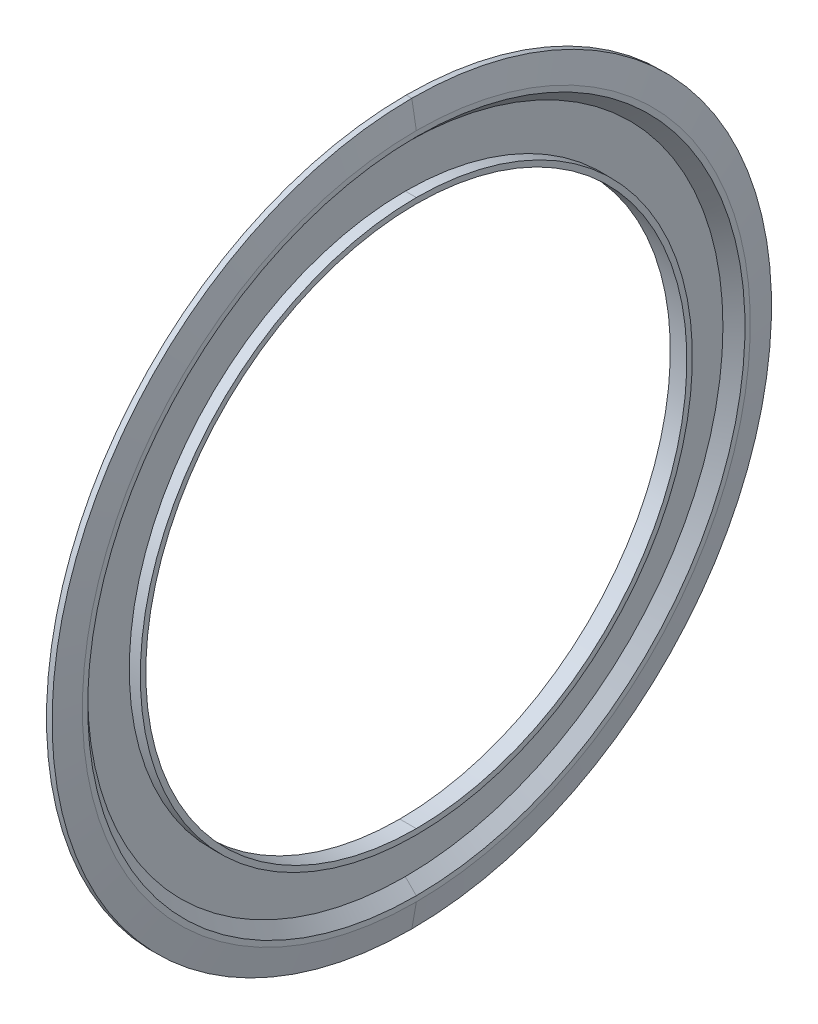
ISO-10303-21;
HEADER;
FILE_DESCRIPTION(('STEP AP214'),'2;1');
FILE_NAME('part.step','',(''),(''),'','','');
FILE_SCHEMA(('AUTOMOTIVE_DESIGN { 1 0 10303 214 1 1 1 1 }'));
ENDSEC;
DATA;
#1=APPLICATION_CONTEXT('core data for automotive mechanical design processes');
#2=APPLICATION_PROTOCOL_DEFINITION('international standard','automotive_design',2000,#1);
#3=PRODUCT_CONTEXT('',#1,'mechanical');
#4=PRODUCT('Part','Part','',(#3));
#5=PRODUCT_RELATED_PRODUCT_CATEGORY('part','',(#4));
#6=PRODUCT_DEFINITION_FORMATION('','',#4);
#7=PRODUCT_DEFINITION_CONTEXT('part definition',#1,'design');
#8=PRODUCT_DEFINITION('design','',#6,#7);
#9=PRODUCT_DEFINITION_SHAPE('','',#8);
#10=(LENGTH_UNIT() NAMED_UNIT(*) SI_UNIT(.MILLI.,.METRE.));
#11=(NAMED_UNIT(*) PLANE_ANGLE_UNIT() SI_UNIT($,.RADIAN.));
#12=(NAMED_UNIT(*) SI_UNIT($,.STERADIAN.) SOLID_ANGLE_UNIT());
#13=UNCERTAINTY_MEASURE_WITH_UNIT(LENGTH_MEASURE(1.E-05),#10,'distance_accuracy_value','');
#14=(GEOMETRIC_REPRESENTATION_CONTEXT(3) GLOBAL_UNCERTAINTY_ASSIGNED_CONTEXT((#13)) GLOBAL_UNIT_ASSIGNED_CONTEXT((#10,
#11,#12)) REPRESENTATION_CONTEXT('',''));
#15=CARTESIAN_POINT('',(0.,0.,0.));
#16=DIRECTION('',(0.,0.,1.));
#17=DIRECTION('',(1.,0.,0.));
#18=AXIS2_PLACEMENT_3D('',#15,#16,#17);
#19=CARTESIAN_POINT('',(1.29101299543363,19.84,0.));
#20=DIRECTION('',(1.,0.,0.));
#21=DIRECTION('',(0.,0.,1.));
#22=AXIS2_PLACEMENT_3D('',#19,#20,#21);
#23=PLANE('',#22);
#24=CARTESIAN_POINT('',(1.29101299543363,0.,0.));
#25=DIRECTION('',(-1.,0.,0.));
#26=DIRECTION('',(0.,1.,0.));
#27=AXIS2_PLACEMENT_3D('',#24,#25,#26);
#28=CIRCLE('',#27,19.68);
#29=CARTESIAN_POINT('',(1.29101299543363,19.68,0.));
#30=VERTEX_POINT('',#29);
#31=CARTESIAN_POINT('',(1.29101299543363,-19.68,0.));
#32=VERTEX_POINT('',#31);
#33=EDGE_CURVE('E11',#30,#32,#28,.T.);
#34=ORIENTED_EDGE('',*,*,#33,.T.);
#35=CARTESIAN_POINT('',(1.29101299543363,0.,0.));
#36=DIRECTION('',(-1.,0.,0.));
#37=DIRECTION('',(0.,1.,0.));
#38=AXIS2_PLACEMENT_3D('',#35,#36,#37);
#39=CIRCLE('',#38,19.68);
#40=EDGE_CURVE('E112',#32,#30,#39,.T.);
#41=ORIENTED_EDGE('',*,*,#40,.T.);
#42=EDGE_LOOP('',(#34,#41));
#43=FACE_BOUND('',#42,.T.);
#44=CARTESIAN_POINT('',(1.29101299543363,0.,0.));
#45=DIRECTION('',(-1.,0.,0.));
#46=DIRECTION('',(0.,1.,0.));
#47=AXIS2_PLACEMENT_3D('',#44,#45,#46);
#48=CIRCLE('',#47,20.);
#49=CARTESIAN_POINT('',(1.29101299543363,20.,0.));
#50=VERTEX_POINT('',#49);
#51=CARTESIAN_POINT('',(1.29101299543363,-20.,0.));
#52=VERTEX_POINT('',#51);
#53=EDGE_CURVE('E190',#50,#52,#48,.T.);
#54=ORIENTED_EDGE('',*,*,#53,.F.);
#55=CARTESIAN_POINT('',(1.29101299543363,0.,0.));
#56=DIRECTION('',(-1.,0.,0.));
#57=DIRECTION('',(0.,1.,0.));
#58=AXIS2_PLACEMENT_3D('',#55,#56,#57);
#59=CIRCLE('',#58,20.);
#60=EDGE_CURVE('E32',#52,#50,#59,.T.);
#61=ORIENTED_EDGE('',*,*,#60,.F.);
#62=EDGE_LOOP('',(#54,#61));
#63=FACE_BOUND('',#62,.T.);
#64=ADVANCED_FACE('F19',(#43,#63),#23,.T.);
#65=CARTESIAN_POINT('',(0.961012995433626,0.,0.));
#66=DIRECTION('',(1.,0.,0.));
#67=DIRECTION('',(0.,1.,0.));
#68=AXIS2_PLACEMENT_3D('',#65,#66,#67);
#69=CONICAL_SURFACE('',#68,19.35,0.785398163397446);
#70=DIRECTION('',(-0.707106781186549,-0.707106781186546,0.));
#71=VECTOR('',#70,1.);
#72=CARTESIAN_POINT('',(0.961012995433626,19.35,0.));
#73=LINE('',#72,#71);
#74=CARTESIAN_POINT('',(0.631012995433625,19.02,0.));
#75=VERTEX_POINT('',#74);
#76=EDGE_CURVE('E107',#30,#75,#73,.T.);
#77=ORIENTED_EDGE('',*,*,#76,.T.);
#78=CARTESIAN_POINT('',(0.631012995433625,0.,0.));
#79=DIRECTION('',(-1.,0.,0.));
#80=DIRECTION('',(0.,1.,0.));
#81=AXIS2_PLACEMENT_3D('',#78,#79,#80);
#82=CIRCLE('',#81,19.02);
#83=CARTESIAN_POINT('',(0.631012995433625,-19.02,0.));
#84=VERTEX_POINT('',#83);
#85=EDGE_CURVE('E26',#75,#84,#82,.T.);
#86=ORIENTED_EDGE('',*,*,#85,.T.);
#87=DIRECTION('',(0.707106781186549,-0.707106781186546,0.));
#88=VECTOR('',#87,1.);
#89=CARTESIAN_POINT('',(0.961012995433626,-19.35,0.));
#90=LINE('',#89,#88);
#91=EDGE_CURVE('E109',#84,#32,#90,.T.);
#92=ORIENTED_EDGE('',*,*,#91,.T.);
#93=ORIENTED_EDGE('',*,*,#33,.F.);
#94=EDGE_LOOP('',(#77,#86,#92,#93));
#95=FACE_BOUND('',#94,.T.);
#96=ADVANCED_FACE('F105',(#95),#69,.F.);
#97=CARTESIAN_POINT('',(0.631012995433625,17.775,0.));
#98=DIRECTION('',(1.,0.,0.));
#99=DIRECTION('',(0.,-1.,0.));
#100=AXIS2_PLACEMENT_3D('',#97,#98,#99);
#101=PLANE('',#100);
#102=CARTESIAN_POINT('',(0.631012995433625,0.,0.));
#103=DIRECTION('',(-1.,0.,0.));
#104=DIRECTION('',(0.,1.,0.));
#105=AXIS2_PLACEMENT_3D('',#102,#103,#104);
#106=CIRCLE('',#105,16.53);
#107=CARTESIAN_POINT('',(0.631012995433625,16.53,0.));
#108=VERTEX_POINT('',#107);
#109=CARTESIAN_POINT('',(0.631012995433625,-16.53,0.));
#110=VERTEX_POINT('',#109);
#111=EDGE_CURVE('E151',#108,#110,#106,.T.);
#112=ORIENTED_EDGE('',*,*,#111,.T.);
#113=CARTESIAN_POINT('',(0.631012995433625,0.,0.));
#114=DIRECTION('',(-1.,0.,0.));
#115=DIRECTION('',(0.,1.,0.));
#116=AXIS2_PLACEMENT_3D('',#113,#114,#115);
#117=CIRCLE('',#116,16.53);
#118=EDGE_CURVE('E130',#110,#108,#117,.T.);
#119=ORIENTED_EDGE('',*,*,#118,.T.);
#120=EDGE_LOOP('',(#112,#119));
#121=FACE_BOUND('',#120,.T.);
#122=ORIENTED_EDGE('',*,*,#85,.F.);
#123=CARTESIAN_POINT('',(0.631012995433625,0.,0.));
#124=DIRECTION('',(-1.,0.,0.));
#125=DIRECTION('',(0.,1.,0.));
#126=AXIS2_PLACEMENT_3D('',#123,#124,#125);
#127=CIRCLE('',#126,19.02);
#128=EDGE_CURVE('E118',#84,#75,#127,.T.);
#129=ORIENTED_EDGE('',*,*,#128,.F.);
#130=EDGE_LOOP('',(#122,#129));
#131=FACE_BOUND('',#130,.T.);
#132=ADVANCED_FACE('F206',(#121,#131),#101,.T.);
#133=CARTESIAN_POINT('',(0.961012995433626,0.,0.));
#134=DIRECTION('',(-1.,0.,0.));
#135=DIRECTION('',(0.,1.,0.));
#136=AXIS2_PLACEMENT_3D('',#133,#134,#135);
#137=CYLINDRICAL_SURFACE('',#136,16.53);
#138=DIRECTION('',(-1.,0.,0.));
#139=VECTOR('',#138,1.);
#140=CARTESIAN_POINT('',(0.961012995433626,16.53,0.));
#141=LINE('',#140,#139);
#142=CARTESIAN_POINT('',(1.29101299543363,16.53,0.));
#143=VERTEX_POINT('',#142);
#144=EDGE_CURVE('E137',#143,#108,#141,.T.);
#145=ORIENTED_EDGE('',*,*,#144,.T.);
#146=ORIENTED_EDGE('',*,*,#118,.F.);
#147=DIRECTION('',(1.,0.,0.));
#148=VECTOR('',#147,1.);
#149=CARTESIAN_POINT('',(0.961012995433626,-16.53,0.));
#150=LINE('',#149,#148);
#151=CARTESIAN_POINT('',(1.29101299543363,-16.53,0.));
#152=VERTEX_POINT('',#151);
#153=EDGE_CURVE('E143',#110,#152,#150,.T.);
#154=ORIENTED_EDGE('',*,*,#153,.T.);
#155=CARTESIAN_POINT('',(1.29101299543363,0.,0.));
#156=DIRECTION('',(-1.,0.,0.));
#157=DIRECTION('',(0.,1.,0.));
#158=AXIS2_PLACEMENT_3D('',#155,#156,#157);
#159=CIRCLE('',#158,16.53);
#160=EDGE_CURVE('E132',#152,#143,#159,.T.);
#161=ORIENTED_EDGE('',*,*,#160,.T.);
#162=EDGE_LOOP('',(#145,#146,#154,#161));
#163=FACE_BOUND('',#162,.T.);
#164=ADVANCED_FACE('F208',(#163),#137,.T.);
#165=CARTESIAN_POINT('',(1.29101299543363,16.365,0.));
#166=DIRECTION('',(1.,0.,0.));
#167=DIRECTION('',(0.,0.,1.));
#168=AXIS2_PLACEMENT_3D('',#165,#166,#167);
#169=PLANE('',#168);
#170=CARTESIAN_POINT('',(1.29101299543363,0.,0.));
#171=DIRECTION('',(-1.,0.,0.));
#172=DIRECTION('',(0.,1.,0.));
#173=AXIS2_PLACEMENT_3D('',#170,#171,#172);
#174=CIRCLE('',#173,16.2);
#175=CARTESIAN_POINT('',(1.29101299543363,16.2,0.));
#176=VERTEX_POINT('',#175);
#177=CARTESIAN_POINT('',(1.29101299543363,-16.2,0.));
#178=VERTEX_POINT('',#177);
#179=EDGE_CURVE('E203',#176,#178,#174,.T.);
#180=ORIENTED_EDGE('',*,*,#179,.T.);
#181=CARTESIAN_POINT('',(1.29101299543363,0.,0.));
#182=DIRECTION('',(-1.,0.,0.));
#183=DIRECTION('',(0.,1.,0.));
#184=AXIS2_PLACEMENT_3D('',#181,#182,#183);
#185=CIRCLE('',#184,16.2);
#186=EDGE_CURVE('E124',#178,#176,#185,.T.);
#187=ORIENTED_EDGE('',*,*,#186,.T.);
#188=EDGE_LOOP('',(#180,#187));
#189=FACE_BOUND('',#188,.T.);
#190=CARTESIAN_POINT('',(1.29101299543363,0.,0.));
#191=DIRECTION('',(-1.,0.,0.));
#192=DIRECTION('',(0.,1.,0.));
#193=AXIS2_PLACEMENT_3D('',#190,#191,#192);
#194=CIRCLE('',#193,16.53);
#195=EDGE_CURVE('E140',#143,#152,#194,.T.);
#196=ORIENTED_EDGE('',*,*,#195,.F.);
#197=ORIENTED_EDGE('',*,*,#160,.F.);
#198=EDGE_LOOP('',(#196,#197));
#199=FACE_BOUND('',#198,.T.);
#200=ADVANCED_FACE('F216',(#189,#199),#169,.T.);
#201=CARTESIAN_POINT('',(0.796012995433625,0.,0.));
#202=DIRECTION('',(-1.,0.,0.));
#203=DIRECTION('',(0.,1.,0.));
#204=AXIS2_PLACEMENT_3D('',#201,#202,#203);
#205=CYLINDRICAL_SURFACE('',#204,16.2);
#206=DIRECTION('',(-1.,0.,0.));
#207=VECTOR('',#206,1.);
#208=CARTESIAN_POINT('',(0.796012995433625,16.2,0.));
#209=LINE('',#208,#207);
#210=CARTESIAN_POINT('',(0.301012995433624,16.2,0.));
#211=VERTEX_POINT('',#210);
#212=EDGE_CURVE('E128',#176,#211,#209,.T.);
#213=ORIENTED_EDGE('',*,*,#212,.T.);
#214=CARTESIAN_POINT('',(0.301012995433624,0.,0.));
#215=DIRECTION('',(-1.,0.,0.));
#216=DIRECTION('',(0.,1.,0.));
#217=AXIS2_PLACEMENT_3D('',#214,#215,#216);
#218=CIRCLE('',#217,16.2);
#219=CARTESIAN_POINT('',(0.301012995433624,-16.2,0.));
#220=VERTEX_POINT('',#219);
#221=EDGE_CURVE('E201',#211,#220,#218,.T.);
#222=ORIENTED_EDGE('',*,*,#221,.T.);
#223=DIRECTION('',(1.,0.,0.));
#224=VECTOR('',#223,1.);
#225=CARTESIAN_POINT('',(0.796012995433625,-16.2,0.));
#226=LINE('',#225,#224);
#227=EDGE_CURVE('E127',#220,#178,#226,.T.);
#228=ORIENTED_EDGE('',*,*,#227,.T.);
#229=ORIENTED_EDGE('',*,*,#179,.F.);
#230=EDGE_LOOP('',(#213,#222,#228,#229));
#231=FACE_BOUND('',#230,.T.);
#232=ADVANCED_FACE('F250',(#231),#205,.F.);
#233=CARTESIAN_POINT('',(0.301012995433625,17.6783452377916,0.));
#234=DIRECTION('',(-1.,0.,0.));
#235=DIRECTION('',(0.,0.,1.));
#236=AXIS2_PLACEMENT_3D('',#233,#234,#235);
#237=PLANE('',#236);
#238=ORIENTED_EDGE('',*,*,#221,.F.);
#239=CARTESIAN_POINT('',(0.301012995433624,0.,0.));
#240=DIRECTION('',(-1.,0.,0.));
#241=DIRECTION('',(0.,1.,0.));
#242=AXIS2_PLACEMENT_3D('',#239,#240,#241);
#243=CIRCLE('',#242,16.2);
#244=EDGE_CURVE('E135',#220,#211,#243,.T.);
#245=ORIENTED_EDGE('',*,*,#244,.F.);
#246=EDGE_LOOP('',(#238,#245));
#247=FACE_BOUND('',#246,.T.);
#248=CARTESIAN_POINT('',(0.301012995433625,0.,0.));
#249=DIRECTION('',(-1.,0.,0.));
#250=DIRECTION('',(0.,1.,0.));
#251=AXIS2_PLACEMENT_3D('',#248,#249,#250);
#252=CIRCLE('',#251,19.1566904755831);
#253=CARTESIAN_POINT('',(0.301012995433625,19.1566904755831,0.));
#254=VERTEX_POINT('',#253);
#255=CARTESIAN_POINT('',(0.301012995433625,-19.1566904755831,0.));
#256=VERTEX_POINT('',#255);
#257=EDGE_CURVE('E154',#254,#256,#252,.T.);
#258=ORIENTED_EDGE('',*,*,#257,.T.);
#259=CARTESIAN_POINT('',(0.301012995433625,0.,0.));
#260=DIRECTION('',(-1.,0.,0.));
#261=DIRECTION('',(0.,1.,0.));
#262=AXIS2_PLACEMENT_3D('',#259,#260,#261);
#263=CIRCLE('',#262,19.1566904755831);
#264=EDGE_CURVE('E199',#256,#254,#263,.T.);
#265=ORIENTED_EDGE('',*,*,#264,.T.);
#266=EDGE_LOOP('',(#258,#265));
#267=FACE_BOUND('',#266,.T.);
#268=ADVANCED_FACE('F260',(#247,#267),#237,.T.);
#269=CARTESIAN_POINT('',(0.631012995433625,0.,0.));
#270=DIRECTION('',(1.,0.,0.));
#271=DIRECTION('',(0.,1.,0.));
#272=AXIS2_PLACEMENT_3D('',#269,#270,#271);
#273=CONICAL_SURFACE('',#272,19.4866904755831,0.785398163397448);
#274=DIRECTION('',(-0.707106781186547,-0.707106781186548,0.));
#275=VECTOR('',#274,1.);
#276=CARTESIAN_POINT('',(0.631012995433625,19.4866904755831,0.));
#277=LINE('',#276,#275);
#278=CARTESIAN_POINT('',(0.961012995433626,19.8166904755831,0.));
#279=VERTEX_POINT('',#278);
#280=EDGE_CURVE('E148',#279,#254,#277,.T.);
#281=ORIENTED_EDGE('',*,*,#280,.T.);
#282=ORIENTED_EDGE('',*,*,#264,.F.);
#283=DIRECTION('',(0.707106781186547,-0.707106781186548,0.));
#284=VECTOR('',#283,1.);
#285=CARTESIAN_POINT('',(0.631012995433625,-19.4866904755831,0.));
#286=LINE('',#285,#284);
#287=CARTESIAN_POINT('',(0.961012995433626,-19.8166904755831,0.));
#288=VERTEX_POINT('',#287);
#289=EDGE_CURVE('E147',#256,#288,#286,.T.);
#290=ORIENTED_EDGE('',*,*,#289,.T.);
#291=CARTESIAN_POINT('',(0.961012995433626,0.,0.));
#292=DIRECTION('',(-1.,0.,0.));
#293=DIRECTION('',(0.,1.,0.));
#294=AXIS2_PLACEMENT_3D('',#291,#292,#293);
#295=CIRCLE('',#294,19.8166904755831);
#296=EDGE_CURVE('E197',#288,#279,#295,.T.);
#297=ORIENTED_EDGE('',*,*,#296,.T.);
#298=EDGE_LOOP('',(#281,#282,#290,#297));
#299=FACE_BOUND('',#298,.T.);
#300=ADVANCED_FACE('F270',(#299),#273,.T.);
#301=CARTESIAN_POINT('',(0.961012995433626,19.8939096083098,0.));
#302=DIRECTION('',(-1.,0.,0.));
#303=DIRECTION('',(0.,0.,1.));
#304=AXIS2_PLACEMENT_3D('',#301,#302,#303);
#305=PLANE('',#304);
#306=CARTESIAN_POINT('',(0.961012995433626,0.,0.));
#307=DIRECTION('',(-1.,0.,0.));
#308=DIRECTION('',(0.,1.,0.));
#309=AXIS2_PLACEMENT_3D('',#306,#307,#308);
#310=CIRCLE('',#309,19.8166904755831);
#311=EDGE_CURVE('E144',#279,#288,#310,.T.);
#312=ORIENTED_EDGE('',*,*,#311,.F.);
#313=ORIENTED_EDGE('',*,*,#296,.F.);
#314=EDGE_LOOP('',(#312,#313));
#315=FACE_BOUND('',#314,.T.);
#316=CARTESIAN_POINT('',(0.961012995433626,0.,0.));
#317=DIRECTION('',(-1.,0.,0.));
#318=DIRECTION('',(0.,1.,0.));
#319=AXIS2_PLACEMENT_3D('',#316,#317,#318);
#320=CIRCLE('',#319,19.9711287410364);
#321=CARTESIAN_POINT('',(0.961012995433626,19.9711287410364,0.));
#322=VERTEX_POINT('',#321);
#323=CARTESIAN_POINT('',(0.961012995433626,-19.9711287410364,0.));
#324=VERTEX_POINT('',#323);
#325=EDGE_CURVE('E121',#322,#324,#320,.T.);
#326=ORIENTED_EDGE('',*,*,#325,.T.);
#327=CARTESIAN_POINT('',(0.961012995433626,0.,0.));
#328=DIRECTION('',(-1.,0.,0.));
#329=DIRECTION('',(0.,1.,0.));
#330=AXIS2_PLACEMENT_3D('',#327,#328,#329);
#331=CIRCLE('',#330,19.9711287410364);
#332=EDGE_CURVE('E168',#324,#322,#331,.T.);
#333=ORIENTED_EDGE('',*,*,#332,.T.);
#334=EDGE_LOOP('',(#326,#333));
#335=FACE_BOUND('',#334,.T.);
#336=ADVANCED_FACE('F280',(#315,#335),#305,.T.);
#337=CARTESIAN_POINT('',(0.822695829326959,0.,0.));
#338=DIRECTION('',(-1.,0.,0.));
#339=DIRECTION('',(0.,1.,0.));
#340=AXIS2_PLACEMENT_3D('',#337,#338,#339);
#341=CONICAL_SURFACE('',#340,20.7555643705182,1.39626340159546);
#342=DIRECTION('',(-0.173648177666931,0.984807753012208,0.));
#343=VECTOR('',#342,1.);
#344=CARTESIAN_POINT('',(0.822695829326959,20.7555643705182,0.));
#345=LINE('',#344,#343);
#346=CARTESIAN_POINT('',(0.684378663220294,21.54,0.));
#347=VERTEX_POINT('',#346);
#348=EDGE_CURVE('E165',#322,#347,#345,.T.);
#349=ORIENTED_EDGE('',*,*,#348,.T.);
#350=CARTESIAN_POINT('',(0.684378663220294,0.,0.));
#351=DIRECTION('',(-1.,0.,0.));
#352=DIRECTION('',(0.,1.,0.));
#353=AXIS2_PLACEMENT_3D('',#350,#351,#352);
#354=CIRCLE('',#353,21.54);
#355=CARTESIAN_POINT('',(0.684378663220294,-21.54,0.));
#356=VERTEX_POINT('',#355);
#357=EDGE_CURVE('E186',#347,#356,#354,.T.);
#358=ORIENTED_EDGE('',*,*,#357,.T.);
#359=DIRECTION('',(0.173648177666931,0.984807753012208,0.));
#360=VECTOR('',#359,1.);
#361=CARTESIAN_POINT('',(0.822695829326959,-20.7555643705182,0.));
#362=LINE('',#361,#360);
#363=EDGE_CURVE('E171',#356,#324,#362,.T.);
#364=ORIENTED_EDGE('',*,*,#363,.T.);
#365=ORIENTED_EDGE('',*,*,#325,.F.);
#366=EDGE_LOOP('',(#349,#358,#364,#365));
#367=FACE_BOUND('',#366,.T.);
#368=ADVANCED_FACE('F290',(#367),#341,.F.);
#369=CARTESIAN_POINT('',(0.851924054181442,0.,0.));
#370=DIRECTION('',(-1.,0.,0.));
#371=DIRECTION('',(0.,1.,0.));
#372=AXIS2_PLACEMENT_3D('',#369,#370,#371);
#373=CYLINDRICAL_SURFACE('',#372,21.54);
#374=DIRECTION('',(-1.,0.,0.));
#375=VECTOR('',#374,1.);
#376=CARTESIAN_POINT('',(0.851924054181442,21.54,0.));
#377=LINE('',#376,#375);
#378=CARTESIAN_POINT('',(1.01946944514259,21.54,0.));
#379=VERTEX_POINT('',#378);
#380=EDGE_CURVE('E177',#379,#347,#377,.T.);
#381=ORIENTED_EDGE('',*,*,#380,.T.);
#382=CARTESIAN_POINT('',(0.684378663220294,0.,0.));
#383=DIRECTION('',(-1.,0.,0.));
#384=DIRECTION('',(0.,1.,0.));
#385=AXIS2_PLACEMENT_3D('',#382,#383,#384);
#386=CIRCLE('',#385,21.54);
#387=EDGE_CURVE('E174',#356,#347,#386,.T.);
#388=ORIENTED_EDGE('',*,*,#387,.F.);
#389=DIRECTION('',(1.,0.,0.));
#390=VECTOR('',#389,1.);
#391=CARTESIAN_POINT('',(0.851924054181442,-21.54,0.));
#392=LINE('',#391,#390);
#393=CARTESIAN_POINT('',(1.01946944514259,-21.54,0.));
#394=VERTEX_POINT('',#393);
#395=EDGE_CURVE('E183',#356,#394,#392,.T.);
#396=ORIENTED_EDGE('',*,*,#395,.T.);
#397=CARTESIAN_POINT('',(1.01946944514259,0.,0.));
#398=DIRECTION('',(-1.,0.,0.));
#399=DIRECTION('',(0.,1.,0.));
#400=AXIS2_PLACEMENT_3D('',#397,#398,#399);
#401=CIRCLE('',#400,21.54);
#402=EDGE_CURVE('E122',#394,#379,#401,.T.);
#403=ORIENTED_EDGE('',*,*,#402,.T.);
#404=EDGE_LOOP('',(#381,#388,#396,#403));
#405=FACE_BOUND('',#404,.T.);
#406=ADVANCED_FACE('F300',(#405),#373,.T.);
#407=CARTESIAN_POINT('',(1.15524122028811,0.,0.));
#408=DIRECTION('',(-1.,0.,0.));
#409=DIRECTION('',(0.,1.,0.));
#410=AXIS2_PLACEMENT_3D('',#407,#408,#409);
#411=CONICAL_SURFACE('',#410,20.77,1.39626340159546);
#412=DIRECTION('',(-0.17364817766693,0.984807753012208,0.));
#413=VECTOR('',#412,1.);
#414=CARTESIAN_POINT('',(1.15524122028811,20.77,0.));
#415=LINE('',#414,#413);
#416=EDGE_CURVE('E188',#50,#379,#415,.T.);
#417=ORIENTED_EDGE('',*,*,#416,.T.);
#418=ORIENTED_EDGE('',*,*,#402,.F.);
#419=DIRECTION('',(0.17364817766693,0.984807753012208,0.));
#420=VECTOR('',#419,1.);
#421=CARTESIAN_POINT('',(1.15524122028811,-20.77,0.));
#422=LINE('',#421,#420);
#423=EDGE_CURVE('E193',#394,#52,#422,.T.);
#424=ORIENTED_EDGE('',*,*,#423,.T.);
#425=ORIENTED_EDGE('',*,*,#60,.T.);
#426=EDGE_LOOP('',(#417,#418,#424,#425));
#427=FACE_BOUND('',#426,.T.);
#428=ADVANCED_FACE('F310',(#427),#411,.T.);
#429=CARTESIAN_POINT('',(1.15524122028811,0.,0.));
#430=DIRECTION('',(-1.,0.,0.));
#431=DIRECTION('',(0.,1.,0.));
#432=AXIS2_PLACEMENT_3D('',#429,#430,#431);
#433=CONICAL_SURFACE('',#432,20.77,1.39626340159546);
#434=ORIENTED_EDGE('',*,*,#416,.F.);
#435=ORIENTED_EDGE('',*,*,#53,.T.);
#436=ORIENTED_EDGE('',*,*,#423,.F.);
#437=CARTESIAN_POINT('',(1.01946944514259,0.,0.));
#438=DIRECTION('',(-1.,0.,0.));
#439=DIRECTION('',(0.,1.,0.));
#440=AXIS2_PLACEMENT_3D('',#437,#438,#439);
#441=CIRCLE('',#440,21.54);
#442=EDGE_CURVE('E180',#379,#394,#441,.T.);
#443=ORIENTED_EDGE('',*,*,#442,.F.);
#444=EDGE_LOOP('',(#434,#435,#436,#443));
#445=FACE_BOUND('',#444,.T.);
#446=ADVANCED_FACE('F320',(#445),#433,.T.);
#447=CARTESIAN_POINT('',(0.851924054181442,0.,0.));
#448=DIRECTION('',(-1.,0.,0.));
#449=DIRECTION('',(0.,1.,0.));
#450=AXIS2_PLACEMENT_3D('',#447,#448,#449);
#451=CYLINDRICAL_SURFACE('',#450,21.54);
#452=ORIENTED_EDGE('',*,*,#380,.F.);
#453=ORIENTED_EDGE('',*,*,#442,.T.);
#454=ORIENTED_EDGE('',*,*,#395,.F.);
#455=ORIENTED_EDGE('',*,*,#357,.F.);
#456=EDGE_LOOP('',(#452,#453,#454,#455));
#457=FACE_BOUND('',#456,.T.);
#458=ADVANCED_FACE('F329',(#457),#451,.T.);
#459=CARTESIAN_POINT('',(0.822695829326959,0.,0.));
#460=DIRECTION('',(-1.,0.,0.));
#461=DIRECTION('',(0.,1.,0.));
#462=AXIS2_PLACEMENT_3D('',#459,#460,#461);
#463=CONICAL_SURFACE('',#462,20.7555643705182,1.39626340159546);
#464=ORIENTED_EDGE('',*,*,#348,.F.);
#465=ORIENTED_EDGE('',*,*,#332,.F.);
#466=ORIENTED_EDGE('',*,*,#363,.F.);
#467=ORIENTED_EDGE('',*,*,#387,.T.);
#468=EDGE_LOOP('',(#464,#465,#466,#467));
#469=FACE_BOUND('',#468,.T.);
#470=ADVANCED_FACE('F339',(#469),#463,.F.);
#471=CARTESIAN_POINT('',(0.631012995433625,0.,0.));
#472=DIRECTION('',(1.,0.,0.));
#473=DIRECTION('',(0.,1.,0.));
#474=AXIS2_PLACEMENT_3D('',#471,#472,#473);
#475=CONICAL_SURFACE('',#474,19.4866904755831,0.785398163397448);
#476=ORIENTED_EDGE('',*,*,#280,.F.);
#477=ORIENTED_EDGE('',*,*,#311,.T.);
#478=ORIENTED_EDGE('',*,*,#289,.F.);
#479=ORIENTED_EDGE('',*,*,#257,.F.);
#480=EDGE_LOOP('',(#476,#477,#478,#479));
#481=FACE_BOUND('',#480,.T.);
#482=ADVANCED_FACE('F349',(#481),#475,.T.);
#483=CARTESIAN_POINT('',(0.796012995433625,0.,0.));
#484=DIRECTION('',(-1.,0.,0.));
#485=DIRECTION('',(0.,1.,0.));
#486=AXIS2_PLACEMENT_3D('',#483,#484,#485);
#487=CYLINDRICAL_SURFACE('',#486,16.2);
#488=ORIENTED_EDGE('',*,*,#212,.F.);
#489=ORIENTED_EDGE('',*,*,#186,.F.);
#490=ORIENTED_EDGE('',*,*,#227,.F.);
#491=ORIENTED_EDGE('',*,*,#244,.T.);
#492=EDGE_LOOP('',(#488,#489,#490,#491));
#493=FACE_BOUND('',#492,.T.);
#494=ADVANCED_FACE('F359',(#493),#487,.F.);
#495=CARTESIAN_POINT('',(0.961012995433626,0.,0.));
#496=DIRECTION('',(-1.,0.,0.));
#497=DIRECTION('',(0.,1.,0.));
#498=AXIS2_PLACEMENT_3D('',#495,#496,#497);
#499=CYLINDRICAL_SURFACE('',#498,16.53);
#500=ORIENTED_EDGE('',*,*,#144,.F.);
#501=ORIENTED_EDGE('',*,*,#195,.T.);
#502=ORIENTED_EDGE('',*,*,#153,.F.);
#503=ORIENTED_EDGE('',*,*,#111,.F.);
#504=EDGE_LOOP('',(#500,#501,#502,#503));
#505=FACE_BOUND('',#504,.T.);
#506=ADVANCED_FACE('F369',(#505),#499,.T.);
#507=CARTESIAN_POINT('',(0.961012995433626,0.,0.));
#508=DIRECTION('',(1.,0.,0.));
#509=DIRECTION('',(0.,1.,0.));
#510=AXIS2_PLACEMENT_3D('',#507,#508,#509);
#511=CONICAL_SURFACE('',#510,19.35,0.785398163397446);
#512=ORIENTED_EDGE('',*,*,#76,.F.);
#513=ORIENTED_EDGE('',*,*,#40,.F.);
#514=ORIENTED_EDGE('',*,*,#91,.F.);
#515=ORIENTED_EDGE('',*,*,#128,.T.);
#516=EDGE_LOOP('',(#512,#513,#514,#515));
#517=FACE_BOUND('',#516,.T.);
#518=ADVANCED_FACE('F116',(#517),#511,.F.);
#519=CLOSED_SHELL('',(#64,#96,#132,#164,#200,#232,#268,#300,#336,#368,#406,#428,#446,#458,#470,
#482,#494,#506,#518));
#520=MANIFOLD_SOLID_BREP('B1',#519);
#521=ADVANCED_BREP_SHAPE_REPRESENTATION('',(#18,#520),#14);
#522=SHAPE_DEFINITION_REPRESENTATION(#9,#521);
ENDSEC;
END-ISO-10303-21;
